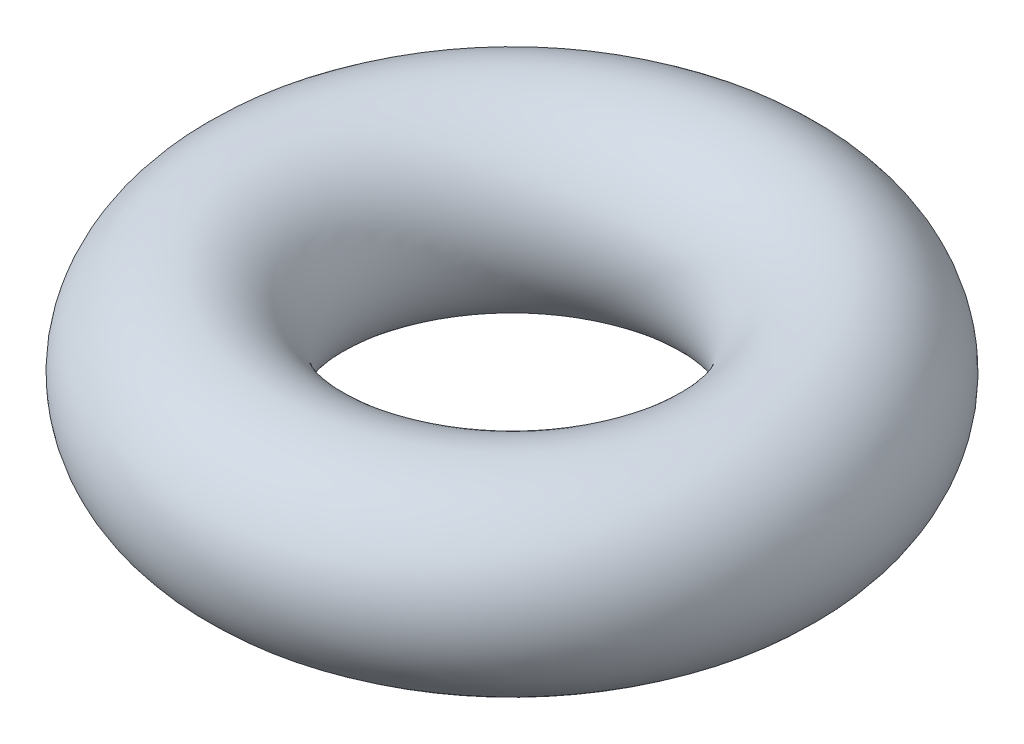
ISO-10303-21;
HEADER;
FILE_DESCRIPTION(('STEP AP214'),'2;1');
FILE_NAME('part.step','',(''),(''),'','','');
FILE_SCHEMA(('AUTOMOTIVE_DESIGN { 1 0 10303 214 1 1 1 1 }'));
ENDSEC;
DATA;
#1=APPLICATION_CONTEXT('core data for automotive mechanical design processes');
#2=APPLICATION_PROTOCOL_DEFINITION('international standard','automotive_design',2000,#1);
#3=PRODUCT_CONTEXT('',#1,'mechanical');
#4=PRODUCT('Part','Part','',(#3));
#5=PRODUCT_RELATED_PRODUCT_CATEGORY('part','',(#4));
#6=PRODUCT_DEFINITION_FORMATION('','',#4);
#7=PRODUCT_DEFINITION_CONTEXT('part definition',#1,'design');
#8=PRODUCT_DEFINITION('design','',#6,#7);
#9=PRODUCT_DEFINITION_SHAPE('','',#8);
#10=(LENGTH_UNIT() NAMED_UNIT(*) SI_UNIT(.MILLI.,.METRE.));
#11=(NAMED_UNIT(*) PLANE_ANGLE_UNIT() SI_UNIT($,.RADIAN.));
#12=(NAMED_UNIT(*) SI_UNIT($,.STERADIAN.) SOLID_ANGLE_UNIT());
#13=UNCERTAINTY_MEASURE_WITH_UNIT(LENGTH_MEASURE(1.E-05),#10,'distance_accuracy_value','');
#14=(GEOMETRIC_REPRESENTATION_CONTEXT(3) GLOBAL_UNCERTAINTY_ASSIGNED_CONTEXT((#13)) GLOBAL_UNIT_ASSIGNED_CONTEXT((#10,
#11,#12)) REPRESENTATION_CONTEXT('',''));
#15=CARTESIAN_POINT('',(0.,0.,0.));
#16=DIRECTION('',(0.,0.,1.));
#17=DIRECTION('',(1.,0.,0.));
#18=AXIS2_PLACEMENT_3D('',#15,#16,#17);
#19=CARTESIAN_POINT('',(0.,0.,0.));
#20=DIRECTION('',(0.,1.,0.));
#21=DIRECTION('',(-1.,0.,0.));
#22=AXIS2_PLACEMENT_3D('',#19,#20,#21);
#23=TOROIDAL_SURFACE('',#22,63.5,25.4);
#24=CARTESIAN_POINT('',(-88.9,0.,0.));
#25=VERTEX_POINT('',#24);
#26=VERTEX_LOOP('',#25);
#27=FACE_BOUND('',#26,.T.);
#28=ADVANCED_FACE('F39',(#27),#23,.T.);
#29=CLOSED_SHELL('',(#28));
#30=MANIFOLD_SOLID_BREP('B2',#29);
#31=ADVANCED_BREP_SHAPE_REPRESENTATION('',(#18,#30),#14);
#32=SHAPE_DEFINITION_REPRESENTATION(#9,#31);
ENDSEC;
END-ISO-10303-21;
